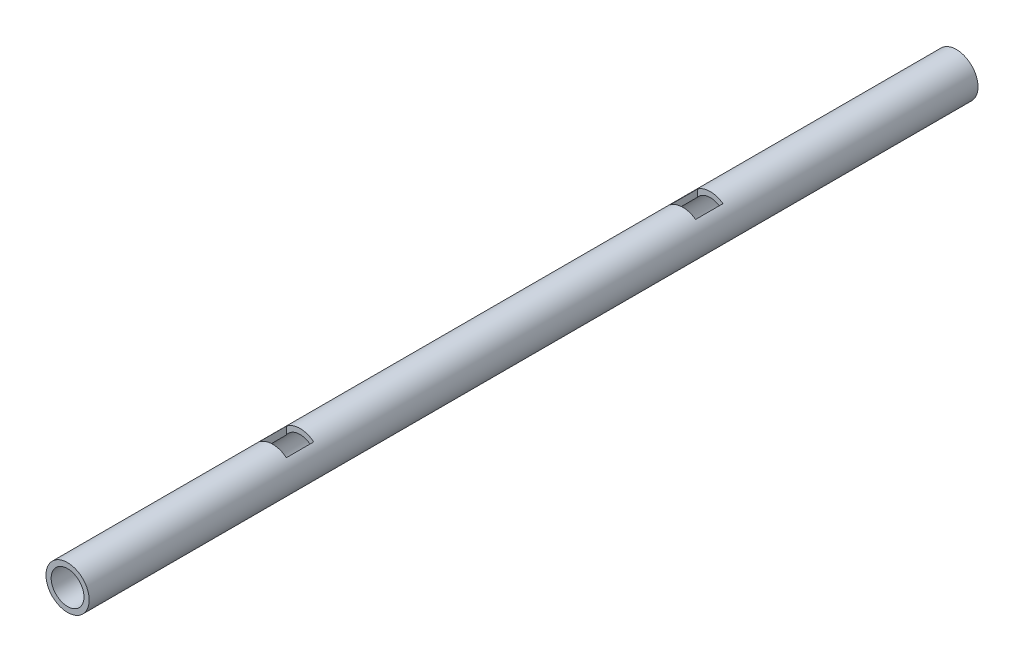
ISO-10303-21;
HEADER;
FILE_DESCRIPTION(('STEP AP214'),'2;1');
FILE_NAME('part.step','',(''),(''),'','','');
FILE_SCHEMA(('AUTOMOTIVE_DESIGN { 1 0 10303 214 1 1 1 1 }'));
ENDSEC;
DATA;
#1=APPLICATION_CONTEXT('core data for automotive mechanical design processes');
#2=APPLICATION_PROTOCOL_DEFINITION('international standard','automotive_design',2000,#1);
#3=PRODUCT_CONTEXT('',#1,'mechanical');
#4=PRODUCT('Part','Part','',(#3));
#5=PRODUCT_RELATED_PRODUCT_CATEGORY('part','',(#4));
#6=PRODUCT_DEFINITION_FORMATION('','',#4);
#7=PRODUCT_DEFINITION_CONTEXT('part definition',#1,'design');
#8=PRODUCT_DEFINITION('design','',#6,#7);
#9=PRODUCT_DEFINITION_SHAPE('','',#8);
#10=(LENGTH_UNIT() NAMED_UNIT(*) SI_UNIT(.MILLI.,.METRE.));
#11=(NAMED_UNIT(*) PLANE_ANGLE_UNIT() SI_UNIT($,.RADIAN.));
#12=(NAMED_UNIT(*) SI_UNIT($,.STERADIAN.) SOLID_ANGLE_UNIT());
#13=UNCERTAINTY_MEASURE_WITH_UNIT(LENGTH_MEASURE(1.E-05),#10,'distance_accuracy_value','');
#14=(GEOMETRIC_REPRESENTATION_CONTEXT(3) GLOBAL_UNCERTAINTY_ASSIGNED_CONTEXT((#13)) GLOBAL_UNIT_ASSIGNED_CONTEXT((#10,
#11,#12)) REPRESENTATION_CONTEXT('',''));
#15=CARTESIAN_POINT('',(0.,0.,0.));
#16=DIRECTION('',(0.,0.,1.));
#17=DIRECTION('',(1.,0.,0.));
#18=AXIS2_PLACEMENT_3D('',#15,#16,#17);
#19=CARTESIAN_POINT('',(0.,0.,162.5));
#20=DIRECTION('',(0.,0.,-1.));
#21=DIRECTION('',(-1.,0.,0.));
#22=AXIS2_PLACEMENT_3D('',#19,#20,#21);
#23=CYLINDRICAL_SURFACE('',#22,7.9);
#24=CARTESIAN_POINT('',(0.,0.,87.5));
#25=DIRECTION('',(0.,0.,-1.));
#26=DIRECTION('',(-1.,0.,0.));
#27=AXIS2_PLACEMENT_3D('',#24,#25,#26);
#28=CIRCLE('',#27,7.9);
#29=CARTESIAN_POINT('',(4.99999999999998,6.11637147334923,87.5));
#30=VERTEX_POINT('',#29);
#31=CARTESIAN_POINT('',(-5.,6.11637147334921,87.5));
#32=VERTEX_POINT('',#31);
#33=EDGE_CURVE('E143',#30,#32,#28,.F.);
#34=ORIENTED_EDGE('',*,*,#33,.T.);
#35=DIRECTION('',(0.,0.,-1.));
#36=VECTOR('',#35,1.);
#37=CARTESIAN_POINT('',(-5.,6.11637147334921,162.5));
#38=LINE('',#37,#36);
#39=CARTESIAN_POINT('',(-5.,6.11637147334921,77.5));
#40=VERTEX_POINT('',#39);
#41=EDGE_CURVE('E159',#32,#40,#38,.T.);
#42=ORIENTED_EDGE('',*,*,#41,.T.);
#43=CARTESIAN_POINT('',(0.,0.,77.5));
#44=DIRECTION('',(0.,0.,1.));
#45=DIRECTION('',(1.,0.,0.));
#46=AXIS2_PLACEMENT_3D('',#43,#44,#45);
#47=CIRCLE('',#46,7.9);
#48=CARTESIAN_POINT('',(4.99999999999998,6.11637147334923,77.5));
#49=VERTEX_POINT('',#48);
#50=EDGE_CURVE('E154',#40,#49,#47,.F.);
#51=ORIENTED_EDGE('',*,*,#50,.T.);
#52=DIRECTION('',(0.,0.,-1.));
#53=VECTOR('',#52,1.);
#54=CARTESIAN_POINT('',(4.99999999999998,6.11637147334923,162.5));
#55=LINE('',#54,#53);
#56=EDGE_CURVE('E148',#49,#30,#55,.F.);
#57=ORIENTED_EDGE('',*,*,#56,.T.);
#58=EDGE_LOOP('',(#34,#42,#51,#57));
#59=FACE_BOUND('',#58,.T.);
#60=CARTESIAN_POINT('',(0.,0.,162.5));
#61=DIRECTION('',(0.,0.,1.));
#62=DIRECTION('',(1.,0.,0.));
#63=AXIS2_PLACEMENT_3D('',#60,#61,#62);
#64=CIRCLE('',#63,7.9);
#65=CARTESIAN_POINT('',(7.9,0.,162.5));
#66=VERTEX_POINT('',#65);
#67=EDGE_CURVE('E183',#66,#66,#64,.T.);
#68=ORIENTED_EDGE('',*,*,#67,.F.);
#69=EDGE_LOOP('',(#68));
#70=FACE_BOUND('',#69,.T.);
#71=CARTESIAN_POINT('',(0.,0.,-162.5));
#72=DIRECTION('',(0.,0.,1.));
#73=DIRECTION('',(1.,0.,0.));
#74=AXIS2_PLACEMENT_3D('',#71,#72,#73);
#75=CIRCLE('',#74,7.9);
#76=CARTESIAN_POINT('',(7.9,0.,-162.5));
#77=VERTEX_POINT('',#76);
#78=EDGE_CURVE('E179',#77,#77,#75,.T.);
#79=ORIENTED_EDGE('',*,*,#78,.T.);
#80=EDGE_LOOP('',(#79));
#81=FACE_BOUND('',#80,.T.);
#82=CARTESIAN_POINT('',(0.,0.,-62.5));
#83=DIRECTION('',(0.,0.,-1.));
#84=DIRECTION('',(-1.,0.,0.));
#85=AXIS2_PLACEMENT_3D('',#82,#83,#84);
#86=CIRCLE('',#85,7.9);
#87=CARTESIAN_POINT('',(4.64524351369936,6.38996969464129,-62.5));
#88=VERTEX_POINT('',#87);
#89=CARTESIAN_POINT('',(-4.64524351369927,6.38996969464135,-62.5));
#90=VERTEX_POINT('',#89);
#91=EDGE_CURVE('E123',#88,#90,#86,.F.);
#92=ORIENTED_EDGE('',*,*,#91,.T.);
#93=DIRECTION('',(0.,0.,-1.));
#94=VECTOR('',#93,1.);
#95=CARTESIAN_POINT('',(-4.64524351369927,6.38996969464135,162.5));
#96=LINE('',#95,#94);
#97=CARTESIAN_POINT('',(-4.64524351369927,6.38996969464135,-72.5));
#98=VERTEX_POINT('',#97);
#99=EDGE_CURVE('E109',#90,#98,#96,.T.);
#100=ORIENTED_EDGE('',*,*,#99,.T.);
#101=CARTESIAN_POINT('',(0.,0.,-72.5));
#102=DIRECTION('',(0.,0.,1.));
#103=DIRECTION('',(1.,0.,0.));
#104=AXIS2_PLACEMENT_3D('',#101,#102,#103);
#105=CIRCLE('',#104,7.9);
#106=CARTESIAN_POINT('',(4.64524351369927,6.38996969464135,-72.5));
#107=VERTEX_POINT('',#106);
#108=EDGE_CURVE('E134',#98,#107,#105,.F.);
#109=ORIENTED_EDGE('',*,*,#108,.T.);
#110=DIRECTION('',(0.,0.,-1.));
#111=VECTOR('',#110,1.);
#112=CARTESIAN_POINT('',(4.64524351369936,6.38996969464129,162.5));
#113=LINE('',#112,#111);
#114=EDGE_CURVE('E128',#107,#88,#113,.F.);
#115=ORIENTED_EDGE('',*,*,#114,.T.);
#116=EDGE_LOOP('',(#92,#100,#109,#115));
#117=FACE_BOUND('',#116,.T.);
#118=ADVANCED_FACE('F45',(#59,#70,#81,#117),#23,.T.);
#119=CARTESIAN_POINT('',(0.,0.,-162.5));
#120=DIRECTION('',(0.,0.,1.));
#121=DIRECTION('',(1.,0.,0.));
#122=AXIS2_PLACEMENT_3D('',#119,#120,#121);
#123=CYLINDRICAL_SURFACE('',#122,6.);
#124=CARTESIAN_POINT('',(0.,0.,87.5));
#125=DIRECTION('',(0.,0.,-1.));
#126=DIRECTION('',(-1.,0.,0.));
#127=AXIS2_PLACEMENT_3D('',#124,#125,#126);
#128=CIRCLE('',#127,6.);
#129=CARTESIAN_POINT('',(4.99999999999998,3.31662479035543,87.5));
#130=VERTEX_POINT('',#129);
#131=CARTESIAN_POINT('',(-5.,3.3166247903554,87.5));
#132=VERTEX_POINT('',#131);
#133=EDGE_CURVE('E200',#130,#132,#128,.F.);
#134=ORIENTED_EDGE('',*,*,#133,.F.);
#135=DIRECTION('',(0.,0.,1.));
#136=VECTOR('',#135,1.);
#137=CARTESIAN_POINT('',(4.99999999999998,3.31662479035543,-162.5));
#138=LINE('',#137,#136);
#139=CARTESIAN_POINT('',(4.99999999999998,3.31662479035543,77.5));
#140=VERTEX_POINT('',#139);
#141=EDGE_CURVE('E187',#140,#130,#138,.T.);
#142=ORIENTED_EDGE('',*,*,#141,.F.);
#143=CARTESIAN_POINT('',(0.,0.,77.5));
#144=DIRECTION('',(0.,0.,1.));
#145=DIRECTION('',(1.,0.,0.));
#146=AXIS2_PLACEMENT_3D('',#143,#144,#145);
#147=CIRCLE('',#146,6.);
#148=CARTESIAN_POINT('',(-5.,3.3166247903554,77.5));
#149=VERTEX_POINT('',#148);
#150=EDGE_CURVE('E193',#149,#140,#147,.F.);
#151=ORIENTED_EDGE('',*,*,#150,.F.);
#152=DIRECTION('',(0.,0.,1.));
#153=VECTOR('',#152,1.);
#154=CARTESIAN_POINT('',(-5.,3.3166247903554,-162.5));
#155=LINE('',#154,#153);
#156=EDGE_CURVE('E197',#132,#149,#155,.F.);
#157=ORIENTED_EDGE('',*,*,#156,.F.);
#158=EDGE_LOOP('',(#134,#142,#151,#157));
#159=FACE_BOUND('',#158,.T.);
#160=CARTESIAN_POINT('',(0.,0.,-162.5));
#161=DIRECTION('',(0.,0.,1.));
#162=DIRECTION('',(1.,0.,0.));
#163=AXIS2_PLACEMENT_3D('',#160,#161,#162);
#164=CIRCLE('',#163,6.);
#165=CARTESIAN_POINT('',(6.,0.,-162.5));
#166=VERTEX_POINT('',#165);
#167=EDGE_CURVE('E175',#166,#166,#164,.T.);
#168=ORIENTED_EDGE('',*,*,#167,.F.);
#169=EDGE_LOOP('',(#168));
#170=FACE_BOUND('',#169,.T.);
#171=CARTESIAN_POINT('',(0.,0.,162.5));
#172=DIRECTION('',(0.,0.,1.));
#173=DIRECTION('',(1.,0.,0.));
#174=AXIS2_PLACEMENT_3D('',#171,#172,#173);
#175=CIRCLE('',#174,6.);
#176=CARTESIAN_POINT('',(6.,0.,162.5));
#177=VERTEX_POINT('',#176);
#178=EDGE_CURVE('E174',#177,#177,#175,.T.);
#179=ORIENTED_EDGE('',*,*,#178,.T.);
#180=EDGE_LOOP('',(#179));
#181=FACE_BOUND('',#180,.T.);
#182=CARTESIAN_POINT('',(0.,0.,-62.5));
#183=DIRECTION('',(0.,0.,-1.));
#184=DIRECTION('',(-1.,0.,0.));
#185=AXIS2_PLACEMENT_3D('',#182,#183,#184);
#186=CIRCLE('',#185,6.);
#187=CARTESIAN_POINT('',(4.64524351369928,3.79759301379638,-62.5));
#188=VERTEX_POINT('',#187);
#189=CARTESIAN_POINT('',(-4.64524351369927,3.79759301379635,-62.5));
#190=VERTEX_POINT('',#189);
#191=EDGE_CURVE('E11',#188,#190,#186,.F.);
#192=ORIENTED_EDGE('',*,*,#191,.F.);
#193=DIRECTION('',(0.,0.,1.));
#194=VECTOR('',#193,1.);
#195=CARTESIAN_POINT('',(4.64524351369924,3.79759301379638,-162.5));
#196=LINE('',#195,#194);
#197=CARTESIAN_POINT('',(4.64524351369924,3.79759301379638,-72.5));
#198=VERTEX_POINT('',#197);
#199=EDGE_CURVE('E203',#198,#188,#196,.T.);
#200=ORIENTED_EDGE('',*,*,#199,.F.);
#201=CARTESIAN_POINT('',(0.,0.,-72.5));
#202=DIRECTION('',(0.,0.,1.));
#203=DIRECTION('',(1.,0.,0.));
#204=AXIS2_PLACEMENT_3D('',#201,#202,#203);
#205=CIRCLE('',#204,6.);
#206=CARTESIAN_POINT('',(-4.64524351369927,3.79759301379635,-72.5));
#207=VERTEX_POINT('',#206);
#208=EDGE_CURVE('E206',#207,#198,#205,.F.);
#209=ORIENTED_EDGE('',*,*,#208,.F.);
#210=DIRECTION('',(0.,0.,1.));
#211=VECTOR('',#210,1.);
#212=CARTESIAN_POINT('',(-4.64524351369927,3.79759301379635,-162.5));
#213=LINE('',#212,#211);
#214=EDGE_CURVE('E53',#190,#207,#213,.F.);
#215=ORIENTED_EDGE('',*,*,#214,.F.);
#216=EDGE_LOOP('',(#192,#200,#209,#215));
#217=FACE_BOUND('',#216,.T.);
#218=ADVANCED_FACE('F214',(#159,#170,#181,#217),#123,.F.);
#219=CARTESIAN_POINT('',(0.,0.,162.5));
#220=DIRECTION('',(0.,0.,1.));
#221=DIRECTION('',(1.,0.,0.));
#222=AXIS2_PLACEMENT_3D('',#219,#220,#221);
#223=PLANE('',#222);
#224=ORIENTED_EDGE('',*,*,#178,.F.);
#225=EDGE_LOOP('',(#224));
#226=FACE_BOUND('',#225,.T.);
#227=ORIENTED_EDGE('',*,*,#67,.T.);
#228=EDGE_LOOP('',(#227));
#229=FACE_BOUND('',#228,.T.);
#230=ADVANCED_FACE('F228',(#226,#229),#223,.T.);
#231=CARTESIAN_POINT('',(0.,0.,-162.5));
#232=DIRECTION('',(0.,0.,1.));
#233=DIRECTION('',(1.,0.,0.));
#234=AXIS2_PLACEMENT_3D('',#231,#232,#233);
#235=PLANE('',#234);
#236=ORIENTED_EDGE('',*,*,#167,.T.);
#237=EDGE_LOOP('',(#236));
#238=FACE_BOUND('',#237,.T.);
#239=ORIENTED_EDGE('',*,*,#78,.F.);
#240=EDGE_LOOP('',(#239));
#241=FACE_BOUND('',#240,.T.);
#242=ADVANCED_FACE('F237',(#238,#241),#235,.F.);
#243=CARTESIAN_POINT('',(-5.,7.901,87.5));
#244=DIRECTION('',(0.,0.,-1.));
#245=DIRECTION('',(-1.,0.,0.));
#246=AXIS2_PLACEMENT_3D('',#243,#244,#245);
#247=PLANE('',#246);
#248=ORIENTED_EDGE('',*,*,#133,.T.);
#249=DIRECTION('',(0.,-1.,0.));
#250=VECTOR('',#249,1.);
#251=CARTESIAN_POINT('',(-5.,7.901,87.5));
#252=LINE('',#251,#250);
#253=EDGE_CURVE('E147',#32,#132,#252,.T.);
#254=ORIENTED_EDGE('',*,*,#253,.F.);
#255=ORIENTED_EDGE('',*,*,#33,.F.);
#256=DIRECTION('',(0.,-1.,0.));
#257=VECTOR('',#256,1.);
#258=CARTESIAN_POINT('',(4.99999999999998,7.901,87.5));
#259=LINE('',#258,#257);
#260=EDGE_CURVE('E152',#30,#130,#259,.T.);
#261=ORIENTED_EDGE('',*,*,#260,.T.);
#262=EDGE_LOOP('',(#248,#254,#255,#261));
#263=FACE_BOUND('',#262,.T.);
#264=ADVANCED_FACE('F239',(#263),#247,.T.);
#265=CARTESIAN_POINT('',(-5.,7.901,87.5));
#266=DIRECTION('',(1.,0.,0.));
#267=DIRECTION('',(0.,0.,-1.));
#268=AXIS2_PLACEMENT_3D('',#265,#266,#267);
#269=PLANE('',#268);
#270=ORIENTED_EDGE('',*,*,#156,.T.);
#271=DIRECTION('',(0.,-1.,0.));
#272=VECTOR('',#271,1.);
#273=CARTESIAN_POINT('',(-5.,7.901,77.5));
#274=LINE('',#273,#272);
#275=EDGE_CURVE('E158',#40,#149,#274,.T.);
#276=ORIENTED_EDGE('',*,*,#275,.F.);
#277=ORIENTED_EDGE('',*,*,#41,.F.);
#278=ORIENTED_EDGE('',*,*,#253,.T.);
#279=EDGE_LOOP('',(#270,#276,#277,#278));
#280=FACE_BOUND('',#279,.T.);
#281=ADVANCED_FACE('F245',(#280),#269,.T.);
#282=CARTESIAN_POINT('',(-5.,7.901,77.5));
#283=DIRECTION('',(0.,0.,1.));
#284=DIRECTION('',(1.,0.,0.));
#285=AXIS2_PLACEMENT_3D('',#282,#283,#284);
#286=PLANE('',#285);
#287=ORIENTED_EDGE('',*,*,#150,.T.);
#288=DIRECTION('',(0.,-1.,0.));
#289=VECTOR('',#288,1.);
#290=CARTESIAN_POINT('',(4.99999999999998,7.901,77.5));
#291=LINE('',#290,#289);
#292=EDGE_CURVE('E153',#49,#140,#291,.T.);
#293=ORIENTED_EDGE('',*,*,#292,.F.);
#294=ORIENTED_EDGE('',*,*,#50,.F.);
#295=ORIENTED_EDGE('',*,*,#275,.T.);
#296=EDGE_LOOP('',(#287,#293,#294,#295));
#297=FACE_BOUND('',#296,.T.);
#298=ADVANCED_FACE('F253',(#297),#286,.T.);
#299=CARTESIAN_POINT('',(4.99999999999998,7.901,87.5));
#300=DIRECTION('',(-1.,0.,0.));
#301=DIRECTION('',(0.,0.,1.));
#302=AXIS2_PLACEMENT_3D('',#299,#300,#301);
#303=PLANE('',#302);
#304=ORIENTED_EDGE('',*,*,#141,.T.);
#305=ORIENTED_EDGE('',*,*,#260,.F.);
#306=ORIENTED_EDGE('',*,*,#56,.F.);
#307=ORIENTED_EDGE('',*,*,#292,.T.);
#308=EDGE_LOOP('',(#304,#305,#306,#307));
#309=FACE_BOUND('',#308,.T.);
#310=ADVANCED_FACE('F257',(#309),#303,.T.);
#311=CARTESIAN_POINT('',(-4.64524351369927,7.901,-62.5));
#312=DIRECTION('',(0.,0.,-1.));
#313=DIRECTION('',(-1.,0.,0.));
#314=AXIS2_PLACEMENT_3D('',#311,#312,#313);
#315=PLANE('',#314);
#316=ORIENTED_EDGE('',*,*,#191,.T.);
#317=DIRECTION('',(0.,-1.,0.));
#318=VECTOR('',#317,1.);
#319=CARTESIAN_POINT('',(-4.64524351369927,7.901,-62.5));
#320=LINE('',#319,#318);
#321=EDGE_CURVE('E112',#90,#190,#320,.T.);
#322=ORIENTED_EDGE('',*,*,#321,.F.);
#323=ORIENTED_EDGE('',*,*,#91,.F.);
#324=DIRECTION('',(0.,-1.,0.));
#325=VECTOR('',#324,1.);
#326=CARTESIAN_POINT('',(4.64524351369928,7.901,-62.5));
#327=LINE('',#326,#325);
#328=EDGE_CURVE('E60',#88,#188,#327,.T.);
#329=ORIENTED_EDGE('',*,*,#328,.T.);
#330=EDGE_LOOP('',(#316,#322,#323,#329));
#331=FACE_BOUND('',#330,.T.);
#332=ADVANCED_FACE('F122',(#331),#315,.T.);
#333=CARTESIAN_POINT('',(-4.64524351369927,7.901,-72.5));
#334=DIRECTION('',(1.,0.,0.));
#335=DIRECTION('',(0.,0.,-1.));
#336=AXIS2_PLACEMENT_3D('',#333,#334,#335);
#337=PLANE('',#336);
#338=ORIENTED_EDGE('',*,*,#214,.T.);
#339=DIRECTION('',(0.,-1.,0.));
#340=VECTOR('',#339,1.);
#341=CARTESIAN_POINT('',(-4.64524351369927,7.901,-72.5));
#342=LINE('',#341,#340);
#343=EDGE_CURVE('E115',#98,#207,#342,.T.);
#344=ORIENTED_EDGE('',*,*,#343,.F.);
#345=ORIENTED_EDGE('',*,*,#99,.F.);
#346=ORIENTED_EDGE('',*,*,#321,.T.);
#347=EDGE_LOOP('',(#338,#344,#345,#346));
#348=FACE_BOUND('',#347,.T.);
#349=ADVANCED_FACE('F111',(#348),#337,.T.);
#350=CARTESIAN_POINT('',(-4.64524351369927,7.901,-72.5));
#351=DIRECTION('',(0.,0.,1.));
#352=DIRECTION('',(1.,0.,0.));
#353=AXIS2_PLACEMENT_3D('',#350,#351,#352);
#354=PLANE('',#353);
#355=ORIENTED_EDGE('',*,*,#208,.T.);
#356=DIRECTION('',(0.,-1.,0.));
#357=VECTOR('',#356,1.);
#358=CARTESIAN_POINT('',(4.64524351369927,7.901,-72.5));
#359=LINE('',#358,#357);
#360=EDGE_CURVE('E65',#107,#198,#359,.T.);
#361=ORIENTED_EDGE('',*,*,#360,.F.);
#362=ORIENTED_EDGE('',*,*,#108,.F.);
#363=ORIENTED_EDGE('',*,*,#343,.T.);
#364=EDGE_LOOP('',(#355,#361,#362,#363));
#365=FACE_BOUND('',#364,.T.);
#366=ADVANCED_FACE('F212',(#365),#354,.T.);
#367=CARTESIAN_POINT('',(4.64524351369927,7.901,-72.5));
#368=DIRECTION('',(-1.,0.,0.));
#369=DIRECTION('',(0.,0.,1.));
#370=AXIS2_PLACEMENT_3D('',#367,#368,#369);
#371=PLANE('',#370);
#372=ORIENTED_EDGE('',*,*,#199,.T.);
#373=ORIENTED_EDGE('',*,*,#328,.F.);
#374=ORIENTED_EDGE('',*,*,#114,.F.);
#375=ORIENTED_EDGE('',*,*,#360,.T.);
#376=EDGE_LOOP('',(#372,#373,#374,#375));
#377=FACE_BOUND('',#376,.T.);
#378=ADVANCED_FACE('F215',(#377),#371,.T.);
#379=CLOSED_SHELL('',(#118,#218,#230,#242,#264,#281,#298,#310,#332,#349,#366,#378));
#380=MANIFOLD_SOLID_BREP('B2',#379);
#381=ADVANCED_BREP_SHAPE_REPRESENTATION('',(#18,#380),#14);
#382=SHAPE_DEFINITION_REPRESENTATION(#9,#381);
ENDSEC;
END-ISO-10303-21;
